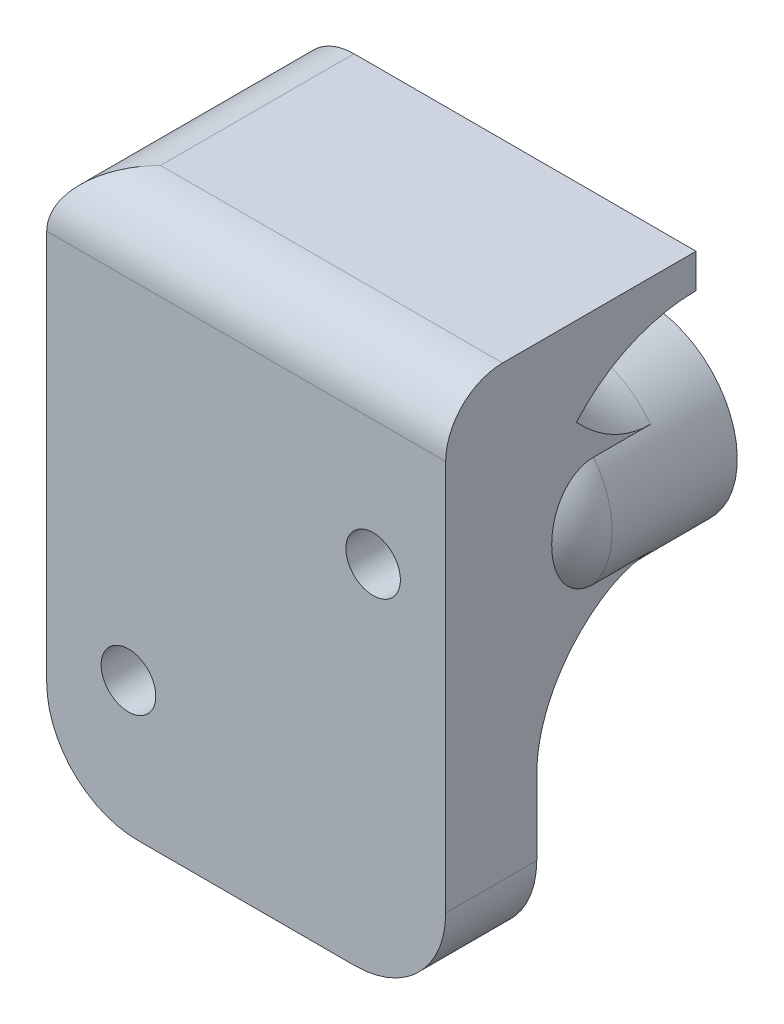
ISO-10303-21;
HEADER;
FILE_DESCRIPTION(('STEP AP214'),'2;1');
FILE_NAME('part.step','',(''),(''),'','','');
FILE_SCHEMA(('AUTOMOTIVE_DESIGN { 1 0 10303 214 1 1 1 1 }'));
ENDSEC;
DATA;
#1=APPLICATION_CONTEXT('core data for automotive mechanical design processes');
#2=APPLICATION_PROTOCOL_DEFINITION('international standard','automotive_design',2000,#1);
#3=PRODUCT_CONTEXT('',#1,'mechanical');
#4=PRODUCT('Part','Part','',(#3));
#5=PRODUCT_RELATED_PRODUCT_CATEGORY('part','',(#4));
#6=PRODUCT_DEFINITION_FORMATION('','',#4);
#7=PRODUCT_DEFINITION_CONTEXT('part definition',#1,'design');
#8=PRODUCT_DEFINITION('design','',#6,#7);
#9=PRODUCT_DEFINITION_SHAPE('','',#8);
#10=(LENGTH_UNIT() NAMED_UNIT(*) SI_UNIT(.MILLI.,.METRE.));
#11=(NAMED_UNIT(*) PLANE_ANGLE_UNIT() SI_UNIT($,.RADIAN.));
#12=(NAMED_UNIT(*) SI_UNIT($,.STERADIAN.) SOLID_ANGLE_UNIT());
#13=UNCERTAINTY_MEASURE_WITH_UNIT(LENGTH_MEASURE(1.E-05),#10,'distance_accuracy_value','');
#14=(GEOMETRIC_REPRESENTATION_CONTEXT(3) GLOBAL_UNCERTAINTY_ASSIGNED_CONTEXT((#13)) GLOBAL_UNIT_ASSIGNED_CONTEXT((#10,
#11,#12)) REPRESENTATION_CONTEXT('',''));
#15=CARTESIAN_POINT('',(0.,0.,0.));
#16=DIRECTION('',(0.,0.,1.));
#17=DIRECTION('',(1.,0.,0.));
#18=AXIS2_PLACEMENT_3D('',#15,#16,#17);
#19=CARTESIAN_POINT('',(0.,0.,0.));
#20=DIRECTION('',(0.,0.,-1.));
#21=DIRECTION('',(-1.,0.,0.));
#22=AXIS2_PLACEMENT_3D('',#19,#20,#21);
#23=PLANE('',#22);
#24=CARTESIAN_POINT('',(5.79110127419194,7.12966177068777,0.));
#25=DIRECTION('',(0.,0.,1.));
#26=DIRECTION('',(1.,0.,0.));
#27=AXIS2_PLACEMENT_3D('',#24,#25,#26);
#28=CIRCLE('',#27,1.2);
#29=CARTESIAN_POINT('',(6.99110127419194,7.12966177068777,0.));
#30=VERTEX_POINT('',#29);
#31=EDGE_CURVE('E157',#30,#30,#28,.T.);
#32=ORIENTED_EDGE('',*,*,#31,.T.);
#33=EDGE_LOOP('',(#32));
#34=FACE_BOUND('',#33,.T.);
#35=DIRECTION('',(0.,-1.,0.));
#36=VECTOR('',#35,1.);
#37=CARTESIAN_POINT('',(2.20085117670349,1.24866858143758,0.));
#38=LINE('',#37,#36);
#39=CARTESIAN_POINT('',(2.20085117670349,16.4296617706878,0.));
#40=VERTEX_POINT('',#39);
#41=CARTESIAN_POINT('',(2.20085117670349,5.24866858143758,0.));
#42=VERTEX_POINT('',#41);
#43=EDGE_CURVE('E161',#40,#42,#38,.T.);
#44=ORIENTED_EDGE('',*,*,#43,.F.);
#45=DIRECTION('',(-1.,0.,0.));
#46=VECTOR('',#45,1.);
#47=CARTESIAN_POINT('',(0.,16.4296617706878,0.));
#48=LINE('',#47,#46);
#49=CARTESIAN_POINT('',(7.55500089638622,16.4296617706878,0.));
#50=VERTEX_POINT('',#49);
#51=EDGE_CURVE('E246',#40,#50,#48,.F.);
#52=ORIENTED_EDGE('',*,*,#51,.T.);
#53=CARTESIAN_POINT('',(16.5411012741919,16.9296617706878,0.));
#54=DIRECTION('',(0.,0.,-1.));
#55=DIRECTION('',(-1.,0.,0.));
#56=AXIS2_PLACEMENT_3D('',#53,#54,#55);
#57=CIRCLE('',#56,9.);
#58=CARTESIAN_POINT('',(19.7293652888547,8.51331027061327,0.));
#59=VERTEX_POINT('',#58);
#60=EDGE_CURVE('E208',#50,#59,#57,.F.);
#61=ORIENTED_EDGE('',*,*,#60,.T.);
#62=DIRECTION('',(0.,1.,0.));
#63=VECTOR('',#62,1.);
#64=CARTESIAN_POINT('',(19.7293652888547,1.24866858143758,0.));
#65=LINE('',#64,#63);
#66=CARTESIAN_POINT('',(19.7293652888547,5.24866858143758,0.));
#67=VERTEX_POINT('',#66);
#68=EDGE_CURVE('E167',#67,#59,#65,.T.);
#69=ORIENTED_EDGE('',*,*,#68,.F.);
#70=CARTESIAN_POINT('',(15.7293652888547,5.24866858143758,0.));
#71=DIRECTION('',(0.,0.,-1.));
#72=DIRECTION('',(-1.,0.,0.));
#73=AXIS2_PLACEMENT_3D('',#70,#71,#72);
#74=CIRCLE('',#73,4.);
#75=CARTESIAN_POINT('',(15.7293652888547,1.24866858143758,0.));
#76=VERTEX_POINT('',#75);
#77=EDGE_CURVE('E185',#67,#76,#74,.T.);
#78=ORIENTED_EDGE('',*,*,#77,.T.);
#79=DIRECTION('',(1.,0.,0.));
#80=VECTOR('',#79,1.);
#81=CARTESIAN_POINT('',(2.20085117670349,1.24866858143758,0.));
#82=LINE('',#81,#80);
#83=CARTESIAN_POINT('',(6.20085117670349,1.24866858143758,0.));
#84=VERTEX_POINT('',#83);
#85=EDGE_CURVE('E174',#84,#76,#82,.T.);
#86=ORIENTED_EDGE('',*,*,#85,.F.);
#87=CARTESIAN_POINT('',(6.20085117670349,5.24866858143758,0.));
#88=DIRECTION('',(0.,0.,-1.));
#89=DIRECTION('',(-1.,0.,0.));
#90=AXIS2_PLACEMENT_3D('',#87,#88,#89);
#91=CIRCLE('',#90,4.);
#92=EDGE_CURVE('E187',#84,#42,#91,.T.);
#93=ORIENTED_EDGE('',*,*,#92,.T.);
#94=EDGE_LOOP('',(#44,#52,#61,#69,#78,#86,#93));
#95=FACE_BOUND('',#94,.T.);
#96=ADVANCED_FACE('F32',(#34,#95),#23,.T.);
#97=CARTESIAN_POINT('',(0.,0.,4.));
#98=DIRECTION('',(0.,0.,-1.));
#99=DIRECTION('',(-1.,0.,0.));
#100=AXIS2_PLACEMENT_3D('',#97,#98,#99);
#101=PLANE('',#100);
#102=DIRECTION('',(0.,1.,0.));
#103=VECTOR('',#102,1.);
#104=CARTESIAN_POINT('',(19.7293652888547,1.24866858143758,4.));
#105=LINE('',#104,#103);
#106=CARTESIAN_POINT('',(19.7293652888547,5.24866858143758,4.));
#107=VERTEX_POINT('',#106);
#108=CARTESIAN_POINT('',(19.7293652888547,22.4296617706878,4.));
#109=VERTEX_POINT('',#108);
#110=EDGE_CURVE('E170',#107,#109,#105,.T.);
#111=ORIENTED_EDGE('',*,*,#110,.T.);
#112=DIRECTION('',(-1.,0.,0.));
#113=VECTOR('',#112,1.);
#114=CARTESIAN_POINT('',(0.,22.4296617706878,4.));
#115=LINE('',#114,#113);
#116=CARTESIAN_POINT('',(2.20085117670349,22.4296617706878,4.));
#117=VERTEX_POINT('',#116);
#118=EDGE_CURVE('E41',#109,#117,#115,.T.);
#119=ORIENTED_EDGE('',*,*,#118,.T.);
#120=DIRECTION('',(0.,-1.,0.));
#121=VECTOR('',#120,1.);
#122=CARTESIAN_POINT('',(2.20085117670349,1.24866858143758,4.));
#123=LINE('',#122,#121);
#124=CARTESIAN_POINT('',(2.20085117670349,5.24866858143758,4.));
#125=VERTEX_POINT('',#124);
#126=EDGE_CURVE('E164',#117,#125,#123,.T.);
#127=ORIENTED_EDGE('',*,*,#126,.T.);
#128=CARTESIAN_POINT('',(6.20085117670349,5.24866858143758,4.));
#129=DIRECTION('',(0.,0.,-1.));
#130=DIRECTION('',(-1.,0.,0.));
#131=AXIS2_PLACEMENT_3D('',#128,#129,#130);
#132=CIRCLE('',#131,4.);
#133=CARTESIAN_POINT('',(6.20085117670349,1.24866858143758,4.));
#134=VERTEX_POINT('',#133);
#135=EDGE_CURVE('E195',#125,#134,#132,.F.);
#136=ORIENTED_EDGE('',*,*,#135,.T.);
#137=DIRECTION('',(1.,0.,0.));
#138=VECTOR('',#137,1.);
#139=CARTESIAN_POINT('',(2.20085117670349,1.24866858143758,4.));
#140=LINE('',#139,#138);
#141=CARTESIAN_POINT('',(15.7293652888547,1.24866858143758,4.));
#142=VERTEX_POINT('',#141);
#143=EDGE_CURVE('E166',#134,#142,#140,.T.);
#144=ORIENTED_EDGE('',*,*,#143,.T.);
#145=CARTESIAN_POINT('',(15.7293652888547,5.24866858143758,4.));
#146=DIRECTION('',(0.,0.,-1.));
#147=DIRECTION('',(-1.,0.,0.));
#148=AXIS2_PLACEMENT_3D('',#145,#146,#147);
#149=CIRCLE('',#148,4.);
#150=EDGE_CURVE('E193',#142,#107,#149,.F.);
#151=ORIENTED_EDGE('',*,*,#150,.T.);
#152=EDGE_LOOP('',(#111,#119,#127,#136,#144,#151));
#153=FACE_BOUND('',#152,.T.);
#154=CARTESIAN_POINT('',(5.79110127419194,7.12966177068777,4.));
#155=DIRECTION('',(0.,0.,1.));
#156=DIRECTION('',(1.,0.,0.));
#157=AXIS2_PLACEMENT_3D('',#154,#155,#156);
#158=CIRCLE('',#157,1.2);
#159=CARTESIAN_POINT('',(6.99110127419194,7.12966177068777,4.));
#160=VERTEX_POINT('',#159);
#161=EDGE_CURVE('E158',#160,#160,#158,.T.);
#162=ORIENTED_EDGE('',*,*,#161,.F.);
#163=EDGE_LOOP('',(#162));
#164=FACE_BOUND('',#163,.T.);
#165=CARTESIAN_POINT('',(16.5411012741919,16.9296617706878,4.));
#166=DIRECTION('',(0.,0.,1.));
#167=DIRECTION('',(1.,0.,0.));
#168=AXIS2_PLACEMENT_3D('',#165,#166,#167);
#169=CIRCLE('',#168,1.19774028703024);
#170=CARTESIAN_POINT('',(17.7388415612222,16.9296617706878,4.));
#171=VERTEX_POINT('',#170);
#172=EDGE_CURVE('E151',#171,#171,#169,.T.);
#173=ORIENTED_EDGE('',*,*,#172,.F.);
#174=EDGE_LOOP('',(#173));
#175=FACE_BOUND('',#174,.T.);
#176=ADVANCED_FACE('F279',(#153,#164,#175),#101,.F.);
#177=CARTESIAN_POINT('',(2.20085117670349,1.24866858143758,4.));
#178=DIRECTION('',(1.,0.,0.));
#179=DIRECTION('',(0.,0.,-1.));
#180=AXIS2_PLACEMENT_3D('',#177,#178,#179);
#181=PLANE('',#180);
#182=ORIENTED_EDGE('',*,*,#126,.F.);
#183=DIRECTION('',(0.,0.,-1.));
#184=VECTOR('',#183,1.);
#185=CARTESIAN_POINT('',(2.20085117670349,22.4296617706878,4.));
#186=LINE('',#185,#184);
#187=CARTESIAN_POINT('',(2.20085117670349,22.4296617706878,-3.39444872453601));
#188=VERTEX_POINT('',#187);
#189=EDGE_CURVE('E256',#117,#188,#186,.T.);
#190=ORIENTED_EDGE('',*,*,#189,.T.);
#191=CARTESIAN_POINT('',(2.20085117670349,16.4296617706878,-7.));
#192=DIRECTION('',(1.,0.,0.));
#193=DIRECTION('',(0.,0.,-1.));
#194=AXIS2_PLACEMENT_3D('',#191,#192,#193);
#195=CIRCLE('',#194,7.);
#196=EDGE_CURVE('E136',#188,#40,#195,.T.);
#197=ORIENTED_EDGE('',*,*,#196,.T.);
#198=ORIENTED_EDGE('',*,*,#43,.T.);
#199=DIRECTION('',(0.,0.,-1.));
#200=VECTOR('',#199,1.);
#201=CARTESIAN_POINT('',(2.20085117670349,5.24866858143758,4.));
#202=LINE('',#201,#200);
#203=EDGE_CURVE('E190',#42,#125,#202,.F.);
#204=ORIENTED_EDGE('',*,*,#203,.T.);
#205=EDGE_LOOP('',(#182,#190,#197,#198,#204));
#206=FACE_BOUND('',#205,.T.);
#207=ADVANCED_FACE('F285',(#206),#181,.F.);
#208=CARTESIAN_POINT('',(2.20085117670349,1.24866858143758,4.));
#209=DIRECTION('',(0.,1.,0.));
#210=DIRECTION('',(0.,0.,1.));
#211=AXIS2_PLACEMENT_3D('',#208,#209,#210);
#212=PLANE('',#211);
#213=ORIENTED_EDGE('',*,*,#143,.F.);
#214=DIRECTION('',(0.,0.,-1.));
#215=VECTOR('',#214,1.);
#216=CARTESIAN_POINT('',(6.20085117670349,1.24866858143758,4.));
#217=LINE('',#216,#215);
#218=EDGE_CURVE('E182',#134,#84,#217,.T.);
#219=ORIENTED_EDGE('',*,*,#218,.T.);
#220=ORIENTED_EDGE('',*,*,#85,.T.);
#221=DIRECTION('',(0.,0.,-1.));
#222=VECTOR('',#221,1.);
#223=CARTESIAN_POINT('',(15.7293652888547,1.24866858143758,4.));
#224=LINE('',#223,#222);
#225=EDGE_CURVE('E180',#76,#142,#224,.F.);
#226=ORIENTED_EDGE('',*,*,#225,.T.);
#227=EDGE_LOOP('',(#213,#219,#220,#226));
#228=FACE_BOUND('',#227,.T.);
#229=ADVANCED_FACE('F301',(#228),#212,.F.);
#230=CARTESIAN_POINT('',(19.7293652888547,1.24866858143758,4.));
#231=DIRECTION('',(-1.,0.,0.));
#232=DIRECTION('',(0.,0.,1.));
#233=AXIS2_PLACEMENT_3D('',#230,#231,#232);
#234=PLANE('',#233);
#235=DIRECTION('',(0.,0.,-1.));
#236=VECTOR('',#235,1.);
#237=CARTESIAN_POINT('',(19.7293652888547,24.9296617706878,4.));
#238=LINE('',#237,#236);
#239=CARTESIAN_POINT('',(19.7293652888547,24.9296617706878,1.5));
#240=VERTEX_POINT('',#239);
#241=CARTESIAN_POINT('',(19.7293652888547,24.9296617706878,-7.));
#242=VERTEX_POINT('',#241);
#243=EDGE_CURVE('E172',#240,#242,#238,.T.);
#244=ORIENTED_EDGE('',*,*,#243,.F.);
#245=CARTESIAN_POINT('',(19.7293652888547,22.4296617706878,1.5));
#246=DIRECTION('',(-1.,0.,0.));
#247=DIRECTION('',(0.,0.,1.));
#248=AXIS2_PLACEMENT_3D('',#245,#246,#247);
#249=CIRCLE('',#248,2.5);
#250=EDGE_CURVE('E11',#240,#109,#249,.F.);
#251=ORIENTED_EDGE('',*,*,#250,.T.);
#252=ORIENTED_EDGE('',*,*,#110,.F.);
#253=DIRECTION('',(0.,0.,-1.));
#254=VECTOR('',#253,1.);
#255=CARTESIAN_POINT('',(19.7293652888547,5.24866858143758,4.));
#256=LINE('',#255,#254);
#257=EDGE_CURVE('E197',#107,#67,#256,.T.);
#258=ORIENTED_EDGE('',*,*,#257,.T.);
#259=ORIENTED_EDGE('',*,*,#68,.T.);
#260=CARTESIAN_POINT('',(19.7293652888547,8.51331027061327,0.));
#261=CARTESIAN_POINT('',(19.7293652888547,8.70653538306606,3.4774141012101E-05));
#262=CARTESIAN_POINT('',(19.7293652888547,8.89969741678476,-0.00979195988124721));
#263=CARTESIAN_POINT('',(19.7293652888547,9.28398738332101,-0.0483805875134381));
#264=CARTESIAN_POINT('',(19.7293652888547,9.47511670430038,-0.0771285860928726));
#265=CARTESIAN_POINT('',(19.7293652888547,9.85212743336625,-0.152455526897318));
#266=CARTESIAN_POINT('',(19.7293652888547,10.0380394849147,-0.198882236521322));
#267=CARTESIAN_POINT('',(19.7293652888547,10.4048046836004,-0.308643365085156));
#268=CARTESIAN_POINT('',(19.7293652888547,10.5856574845522,-0.371978937923083));
#269=CARTESIAN_POINT('',(19.7293652888547,10.9202157564702,-0.506209951470481));
#270=CARTESIAN_POINT('',(19.7293652888547,11.0746250145604,-0.575358680792301));
#271=CARTESIAN_POINT('',(19.7293652888547,11.3776123108796,-0.725284395465473));
#272=CARTESIAN_POINT('',(19.7293652888547,11.5261910361343,-0.806060005525792));
#273=CARTESIAN_POINT('',(19.7293652888547,11.9630957144002,-1.06534819291589));
#274=CARTESIAN_POINT('',(19.7293652888547,12.2418337841929,-1.26051501792097));
#275=CARTESIAN_POINT('',(19.7293652888547,12.6508186084283,-1.59428296533686));
#276=CARTESIAN_POINT('',(19.7293652888547,12.792166319353,-1.71966665817494));
#277=CARTESIAN_POINT('',(19.7293652888547,13.0640317196447,-1.98187699967119));
#278=CARTESIAN_POINT('',(19.7293652888547,13.1945451618243,-2.11870809406444));
#279=CARTESIAN_POINT('',(19.7293652888547,13.4429438477149,-2.40306648299146));
#280=CARTESIAN_POINT('',(19.7293652888547,13.5608459213102,-2.5505790705424));
#281=CARTESIAN_POINT('',(19.7293652888547,13.7819467475739,-2.85619085906745));
#282=CARTESIAN_POINT('',(19.7293652888547,13.8851584374264,-3.01428056256346));
#283=CARTESIAN_POINT('',(19.7293652888547,14.0310179781795,-3.26740690769278));
#284=CARTESIAN_POINT('',(19.7293652888547,14.0800202018652,-3.35880674366154));
#285=CARTESIAN_POINT('',(19.7293652888547,14.1717195902881,-3.54475905299358));
#286=CARTESIAN_POINT('',(19.7293652888547,14.2144159173193,-3.63931194318242));
#287=CARTESIAN_POINT('',(19.7293652888547,14.2923354518417,-3.83094091263401));
#288=CARTESIAN_POINT('',(19.7293652888547,14.327593672673,-3.92800264080702));
#289=CARTESIAN_POINT('',(19.7293652888547,14.389806688214,-4.12471603083544));
#290=CARTESIAN_POINT('',(19.7293652888547,14.4167655995969,-4.22436638198023));
#291=CARTESIAN_POINT('',(19.7293652888547,14.4634811584599,-4.43551204081681));
#292=CARTESIAN_POINT('',(19.7293652888547,14.4822926247493,-4.54722294467497));
#293=CARTESIAN_POINT('',(19.7293652888547,14.5012837313051,-4.71608297428575));
#294=CARTESIAN_POINT('',(19.7293652888547,14.50607677003,-4.77274177914391));
#295=CARTESIAN_POINT('',(19.7293652888547,14.5124850993961,-4.88626262936694));
#296=CARTESIAN_POINT('',(19.7293652888547,14.514099032008,-4.94312475119746));
#297=CARTESIAN_POINT('',(19.7293652888547,14.5140929820158,-5.));
#298=B_SPLINE_CURVE_WITH_KNOTS('',3,(#260,#261,#262,#263,#264,#265,#266,#267,#268,#269,#270,
#271,#272,#273,#274,#275,#276,#277,#278,#279,#280,#281,#282,#283,#284,#285,#286,#287,#288,#289,
#290,#291,#292,#293,#294,#295,#296,#297),.UNSPECIFIED.,.F.,.F.,(4,2,2,2,2,2,2,2,2,2,2,2,2,2,2,2,
2,2,4),(0.,0.579333604188391,1.15824224259981,1.73227463934319,2.30634621934031,
2.81337446344094,3.32034278267794,4.33670454930488,4.90303877167546,5.46959396688484,
6.03538340442442,6.60067145124535,6.91159758324274,7.22256498309503,7.53203418757615,
7.84134963903098,8.18049195153868,8.35099695333732,8.52157477454315),.UNSPECIFIED.);
#299=CARTESIAN_POINT('',(19.7293652888547,14.5140929820158,-5.));
#300=VERTEX_POINT('',#299);
#301=EDGE_CURVE('E217',#59,#300,#298,.T.);
#302=ORIENTED_EDGE('',*,*,#301,.T.);
#303=DIRECTION('',(0.,0.,1.));
#304=VECTOR('',#303,1.);
#305=CARTESIAN_POINT('',(19.7293652888547,14.5140929820158,0.));
#306=LINE('',#305,#304);
#307=CARTESIAN_POINT('',(19.7293652888547,14.5140929820158,-2.5));
#308=VERTEX_POINT('',#307);
#309=EDGE_CURVE('E200',#308,#300,#306,.F.);
#310=ORIENTED_EDGE('',*,*,#309,.F.);
#311=CARTESIAN_POINT('',(19.7293652888547,14.5140929820158,-2.5));
#312=CARTESIAN_POINT('',(19.7293652888547,14.5140894337805,-2.45347711818692));
#313=CARTESIAN_POINT('',(19.7293652888547,14.5162452140121,-2.40698093774308));
#314=CARTESIAN_POINT('',(19.7293652888547,14.5248162895305,-2.31440079045376));
#315=CARTESIAN_POINT('',(19.7293652888547,14.5312299189341,-2.2683166695338));
#316=CARTESIAN_POINT('',(19.7293652888547,14.5566668303771,-2.1317275092124));
#317=CARTESIAN_POINT('',(19.7293652888547,14.5818878415186,-2.04230563883819));
#318=CARTESIAN_POINT('',(19.7293652888547,14.64749720379,-1.86942210762563));
#319=CARTESIAN_POINT('',(19.7293652888547,14.6878706018194,-1.78595466699716));
#320=CARTESIAN_POINT('',(19.7293652888547,14.7818379711103,-1.62678404409055));
#321=CARTESIAN_POINT('',(19.7293652888547,14.8354432959053,-1.55108760904545));
#322=CARTESIAN_POINT('',(19.7293652888547,14.9544989899357,-1.40774618488951));
#323=CARTESIAN_POINT('',(19.7293652888547,15.020119750595,-1.34024384438985));
#324=CARTESIAN_POINT('',(19.7293652888547,15.1602488434442,-1.21528091909444));
#325=CARTESIAN_POINT('',(19.7293652888547,15.2347601242837,-1.15782368154266));
#326=CARTESIAN_POINT('',(19.7293652888547,15.4274567439655,-1.02815510536161));
#327=CARTESIAN_POINT('',(19.7293652888547,15.5496193191199,-0.961835070500561));
#328=CARTESIAN_POINT('',(19.7293652888547,15.8030858061487,-0.849773590794555));
#329=CARTESIAN_POINT('',(19.7293652888547,15.9344105482196,-0.804080927237992));
#330=CARTESIAN_POINT('',(19.7293652888547,16.2343692742419,-0.722654903894093));
#331=CARTESIAN_POINT('',(19.7293652888547,16.4043634375779,-0.691980378715369));
#332=CARTESIAN_POINT('',(19.7293652888547,16.7469849771354,-0.656592054654963));
#333=CARTESIAN_POINT('',(19.7293652888547,16.919613900913,-0.651894152013298));
#334=CARTESIAN_POINT('',(19.7293652888547,17.2469377100412,-0.667181338895522));
#335=CARTESIAN_POINT('',(19.7293652888547,17.4017436253629,-0.684809820728294));
#336=CARTESIAN_POINT('',(19.7293652888547,17.7071437462165,-0.742329485160848));
#337=CARTESIAN_POINT('',(19.7293652888547,17.8577434232454,-0.782190181836723));
#338=CARTESIAN_POINT('',(19.7293652888547,18.1221279043084,-0.876695799985978));
#339=CARTESIAN_POINT('',(19.7293652888547,18.2374363680366,-0.927042639520271));
#340=CARTESIAN_POINT('',(19.7293652888547,18.4587307249076,-1.04528674372295));
#341=CARTESIAN_POINT('',(19.7293652888547,18.5647278177436,-1.11316252627177));
#342=CARTESIAN_POINT('',(19.7293652888547,18.7449405695409,-1.25312407398523));
#343=CARTESIAN_POINT('',(19.7293652888547,18.8214427333635,-1.32225355244979));
#344=CARTESIAN_POINT('',(19.7293652888547,18.9620794314948,-1.47223774737458));
#345=CARTESIAN_POINT('',(19.7293652888547,19.0262159163156,-1.5530906111046));
#346=CARTESIAN_POINT('',(19.7293652888547,19.1393792537446,-1.72573825215388));
#347=CARTESIAN_POINT('',(19.7293652888547,19.1882851679789,-1.81761296497215));
#348=CARTESIAN_POINT('',(19.7293652888547,19.2672938413723,-2.00908212938374));
#349=CARTESIAN_POINT('',(19.7293652888547,19.2974312765286,-2.10866196011445));
#350=CARTESIAN_POINT('',(19.7293652888547,19.3265105498058,-2.25788115753449));
#351=CARTESIAN_POINT('',(19.7293652888547,19.3335209745311,-2.30605708626224));
#352=CARTESIAN_POINT('',(19.7293652888547,19.3428799753125,-2.40281110669486));
#353=CARTESIAN_POINT('',(19.7293652888547,19.3452331566073,-2.45138875337517));
#354=CARTESIAN_POINT('',(19.7293652888547,19.3452305593598,-2.5));
#355=B_SPLINE_CURVE_WITH_KNOTS('',3,(#311,#312,#313,#314,#315,#316,#317,#318,#319,#320,#321,
#322,#323,#324,#325,#326,#327,#328,#329,#330,#331,#332,#333,#334,#335,#336,#337,#338,#339,#340,
#341,#342,#343,#344,#345,#346,#347,#348,#349,#350,#351,#352,#353,#354),.UNSPECIFIED.,.F.,.F.,(4,
2,2,2,2,2,2,2,2,2,2,2,2,2,2,2,2,2,2,2,2,4),(0.,0.139466889013885,0.278879243749997,
0.55599003841672,0.832828082896295,1.10990449649993,1.39126666915975,1.6727224197741,
2.08741430993559,2.50308182476833,3.01898714905618,3.5352081436356,4.00121323748316,
4.46658088734936,4.84275133933401,5.21846295564366,5.52655547288592,5.83459935303197,
6.14503031552213,6.4548860215234,6.60074185792532,6.7464533949721),.UNSPECIFIED.);
#356=CARTESIAN_POINT('',(19.7293652888547,19.3452305593598,-2.5));
#357=VERTEX_POINT('',#356);
#358=EDGE_CURVE('E250',#308,#357,#355,.T.);
#359=ORIENTED_EDGE('',*,*,#358,.T.);
#360=DIRECTION('',(0.,0.,1.));
#361=VECTOR('',#360,1.);
#362=CARTESIAN_POINT('',(19.7293652888547,19.3452305593598,-5.));
#363=LINE('',#362,#361);
#364=CARTESIAN_POINT('',(19.7293652888547,19.3452305593598,-5.));
#365=VERTEX_POINT('',#364);
#366=EDGE_CURVE('E205',#365,#357,#363,.T.);
#367=ORIENTED_EDGE('',*,*,#366,.F.);
#368=CARTESIAN_POINT('',(19.7293652888547,19.3452305593598,-5.));
#369=CARTESIAN_POINT('',(19.7293652888547,19.3452257538764,-4.94641155230876));
#370=CARTESIAN_POINT('',(19.7293652888547,19.3466578876404,-4.89283366196071));
#371=CARTESIAN_POINT('',(19.7293652888547,19.3523494541674,-4.78583902131151));
#372=CARTESIAN_POINT('',(19.7293652888547,19.3566083027105,-4.73242224000383));
#373=CARTESIAN_POINT('',(19.7293652888547,19.3735245956512,-4.57288626787006));
#374=CARTESIAN_POINT('',(19.7293652888547,19.3903223176076,-4.46718235408305));
#375=CARTESIAN_POINT('',(19.7293652888547,19.433768494182,-4.25948617948964));
#376=CARTESIAN_POINT('',(19.7293652888547,19.4602690726419,-4.15746223191707));
#377=CARTESIAN_POINT('',(19.7293652888547,19.522040218058,-3.95605234976059));
#378=CARTESIAN_POINT('',(19.7293652888547,19.5573171847573,-3.85666839905297));
#379=CARTESIAN_POINT('',(19.7293652888547,19.6477885595841,-3.63015103752753));
#380=CARTESIAN_POINT('',(19.7293652888547,19.7057572652161,-3.50412790279998));
#381=CARTESIAN_POINT('',(19.7293652888547,19.8325626959362,-3.25770909290328));
#382=CARTESIAN_POINT('',(19.7293652888547,19.9014023334134,-3.13731493700663));
#383=CARTESIAN_POINT('',(19.7293652888547,20.0487633353711,-2.90133734643436));
#384=CARTESIAN_POINT('',(19.7293652888547,20.1273554790011,-2.78579833339527));
#385=CARTESIAN_POINT('',(19.7293652888547,20.2925067117484,-2.56054863602586));
#386=CARTESIAN_POINT('',(19.7293652888547,20.3790682088501,-2.45083972919184));
#387=CARTESIAN_POINT('',(19.7293652888547,20.591693985257,-2.19884818937764));
#388=CARTESIAN_POINT('',(19.7293652888547,20.7207515599977,-2.05907626702185));
#389=CARTESIAN_POINT('',(19.7293652888547,20.9901647612702,-1.79093148079402));
#390=CARTESIAN_POINT('',(19.7293652888547,21.1305244591569,-1.66256276002696));
#391=CARTESIAN_POINT('',(19.7293652888547,21.5657863382666,-1.29641792816295));
#392=CARTESIAN_POINT('',(19.7293652888547,21.8760091598187,-1.07627158684845));
#393=CARTESIAN_POINT('',(19.7293652888547,22.3964490745346,-0.769163554134403));
#394=CARTESIAN_POINT('',(19.7293652888547,22.5963987248889,-0.664337484051885));
#395=CARTESIAN_POINT('',(19.7293652888547,23.0060847604094,-0.475893581300193));
#396=CARTESIAN_POINT('',(19.7293652888547,23.2158229649726,-0.392279710076029));
#397=CARTESIAN_POINT('',(19.7293652888547,23.4296617706878,-0.320066818431413));
#398=B_SPLINE_CURVE_WITH_KNOTS('',3,(#368,#369,#370,#371,#372,#373,#374,#375,#376,#377,#378,
#379,#380,#381,#382,#383,#384,#385,#386,#387,#388,#389,#390,#391,#392,#393,#394,#395,#396,#397),
.UNSPECIFIED.,.F.,.F.,(4,2,2,2,2,2,2,2,2,2,2,2,2,2,4),(0.,0.160726006571149,0.321418804947108,
0.641911619544182,0.957710523432183,1.27374038635549,1.68922878162049,2.1048286782003,
2.52364370696536,2.94258570095701,3.51251793426187,4.08265640025004,5.21773922342928,
5.89397425334071,6.57033547946331),.UNSPECIFIED.);
#399=CARTESIAN_POINT('',(19.7293652888547,21.04860921514,-1.74021630621675));
#400=VERTEX_POINT('',#399);
#401=EDGE_CURVE('E131',#365,#400,#398,.T.);
#402=ORIENTED_EDGE('',*,*,#401,.T.);
#403=CARTESIAN_POINT('',(19.7293652888547,16.4296617706878,-7.));
#404=DIRECTION('',(-1.,0.,0.));
#405=DIRECTION('',(0.,0.,1.));
#406=AXIS2_PLACEMENT_3D('',#403,#404,#405);
#407=CIRCLE('',#406,7.);
#408=CARTESIAN_POINT('',(19.7293652888547,23.4296617706878,-7.));
#409=VERTEX_POINT('',#408);
#410=EDGE_CURVE('E126',#400,#409,#407,.T.);
#411=ORIENTED_EDGE('',*,*,#410,.T.);
#412=DIRECTION('',(0.,-1.,0.));
#413=VECTOR('',#412,1.);
#414=CARTESIAN_POINT('',(19.7293652888547,24.9296617706878,-7.));
#415=LINE('',#414,#413);
#416=EDGE_CURVE('E129',#242,#409,#415,.T.);
#417=ORIENTED_EDGE('',*,*,#416,.F.);
#418=EDGE_LOOP('',(#244,#251,#252,#258,#259,#302,#310,#359,#367,#402,#411,#417));
#419=FACE_BOUND('',#418,.T.);
#420=ADVANCED_FACE('F128',(#419),#234,.F.);
#421=CARTESIAN_POINT('',(2.20085117670349,24.9296617706878,4.));
#422=DIRECTION('',(0.,-1.,0.));
#423=DIRECTION('',(0.,0.,-1.));
#424=AXIS2_PLACEMENT_3D('',#421,#422,#423);
#425=PLANE('',#424);
#426=DIRECTION('',(1.,0.,0.));
#427=VECTOR('',#426,1.);
#428=CARTESIAN_POINT('',(19.7293652888547,24.9296617706878,-7.));
#429=LINE('',#428,#427);
#430=CARTESIAN_POINT('',(4.7008511767035,24.9296617706878,-7.));
#431=VERTEX_POINT('',#430);
#432=EDGE_CURVE('E144',#431,#242,#429,.T.);
#433=ORIENTED_EDGE('',*,*,#432,.F.);
#434=DIRECTION('',(0.,0.,-1.));
#435=VECTOR('',#434,1.);
#436=CARTESIAN_POINT('',(4.70085117670349,24.9296617706878,4.));
#437=LINE('',#436,#435);
#438=CARTESIAN_POINT('',(4.70085117670349,24.9296617706878,1.5));
#439=VERTEX_POINT('',#438);
#440=EDGE_CURVE('E54',#431,#439,#437,.F.);
#441=ORIENTED_EDGE('',*,*,#440,.T.);
#442=DIRECTION('',(-1.,0.,0.));
#443=VECTOR('',#442,1.);
#444=CARTESIAN_POINT('',(2.20085117670349,24.9296617706878,1.5));
#445=LINE('',#444,#443);
#446=EDGE_CURVE('E273',#439,#240,#445,.F.);
#447=ORIENTED_EDGE('',*,*,#446,.T.);
#448=ORIENTED_EDGE('',*,*,#243,.T.);
#449=EDGE_LOOP('',(#433,#441,#447,#448));
#450=FACE_BOUND('',#449,.T.);
#451=ADVANCED_FACE('F291',(#450),#425,.F.);
#452=CARTESIAN_POINT('',(5.79110127419194,7.12966177068777,4.));
#453=DIRECTION('',(0.,0.,-1.));
#454=DIRECTION('',(-1.,0.,0.));
#455=AXIS2_PLACEMENT_3D('',#452,#453,#454);
#456=CYLINDRICAL_SURFACE('',#455,1.2);
#457=ORIENTED_EDGE('',*,*,#161,.T.);
#458=EDGE_LOOP('',(#457));
#459=FACE_BOUND('',#458,.T.);
#460=ORIENTED_EDGE('',*,*,#31,.F.);
#461=EDGE_LOOP('',(#460));
#462=FACE_BOUND('',#461,.T.);
#463=ADVANCED_FACE('F293',(#459,#462),#456,.F.);
#464=CARTESIAN_POINT('',(16.5411012741919,16.9296617706878,4.));
#465=DIRECTION('',(0.,0.,-1.));
#466=DIRECTION('',(-1.,0.,0.));
#467=AXIS2_PLACEMENT_3D('',#464,#465,#466);
#468=CYLINDRICAL_SURFACE('',#467,1.19774028703024);
#469=ORIENTED_EDGE('',*,*,#172,.T.);
#470=EDGE_LOOP('',(#469));
#471=FACE_BOUND('',#470,.T.);
#472=CARTESIAN_POINT('',(16.5411012741919,16.9296617706878,-8.));
#473=DIRECTION('',(0.,0.,-1.));
#474=DIRECTION('',(-1.,0.,0.));
#475=AXIS2_PLACEMENT_3D('',#472,#473,#474);
#476=CIRCLE('',#475,1.19774028703024);
#477=CARTESIAN_POINT('',(15.3433609871617,16.9296617706878,-8.));
#478=VERTEX_POINT('',#477);
#479=EDGE_CURVE('E290',#478,#478,#476,.T.);
#480=ORIENTED_EDGE('',*,*,#479,.T.);
#481=EDGE_LOOP('',(#480));
#482=FACE_BOUND('',#481,.T.);
#483=ADVANCED_FACE('F298',(#471,#482),#468,.F.);
#484=CARTESIAN_POINT('',(0.,0.,-7.));
#485=DIRECTION('',(0.,0.,-1.));
#486=DIRECTION('',(-1.,0.,0.));
#487=AXIS2_PLACEMENT_3D('',#484,#485,#486);
#488=PLANE('',#487);
#489=DIRECTION('',(-1.,0.,0.));
#490=VECTOR('',#489,1.);
#491=CARTESIAN_POINT('',(19.7293652888547,23.4296617706878,-7.));
#492=LINE('',#491,#490);
#493=CARTESIAN_POINT('',(2.40956332922557,23.4296617706878,-7.));
#494=VERTEX_POINT('',#493);
#495=EDGE_CURVE('E142',#409,#494,#492,.T.);
#496=ORIENTED_EDGE('',*,*,#495,.T.);
#497=CARTESIAN_POINT('',(4.70085117670349,22.4296617706878,-7.));
#498=DIRECTION('',(0.,0.,-1.));
#499=DIRECTION('',(-1.,0.,0.));
#500=AXIS2_PLACEMENT_3D('',#497,#498,#499);
#501=CIRCLE('',#500,2.5);
#502=EDGE_CURVE('E271',#494,#431,#501,.T.);
#503=ORIENTED_EDGE('',*,*,#502,.T.);
#504=ORIENTED_EDGE('',*,*,#432,.T.);
#505=ORIENTED_EDGE('',*,*,#416,.T.);
#506=EDGE_LOOP('',(#496,#503,#504,#505));
#507=FACE_BOUND('',#506,.T.);
#508=ADVANCED_FACE('F141',(#507),#488,.T.);
#509=CARTESIAN_POINT('',(6.20085117670349,5.24866858143758,4.));
#510=DIRECTION('',(0.,0.,-1.));
#511=DIRECTION('',(-1.,0.,0.));
#512=AXIS2_PLACEMENT_3D('',#509,#510,#511);
#513=CYLINDRICAL_SURFACE('',#512,4.);
#514=ORIENTED_EDGE('',*,*,#135,.F.);
#515=ORIENTED_EDGE('',*,*,#203,.F.);
#516=ORIENTED_EDGE('',*,*,#92,.F.);
#517=ORIENTED_EDGE('',*,*,#218,.F.);
#518=EDGE_LOOP('',(#514,#515,#516,#517));
#519=FACE_BOUND('',#518,.T.);
#520=ADVANCED_FACE('F316',(#519),#513,.T.);
#521=CARTESIAN_POINT('',(15.7293652888547,5.24866858143758,4.));
#522=DIRECTION('',(0.,0.,-1.));
#523=DIRECTION('',(-1.,0.,0.));
#524=AXIS2_PLACEMENT_3D('',#521,#522,#523);
#525=CYLINDRICAL_SURFACE('',#524,4.);
#526=ORIENTED_EDGE('',*,*,#150,.F.);
#527=ORIENTED_EDGE('',*,*,#225,.F.);
#528=ORIENTED_EDGE('',*,*,#77,.F.);
#529=ORIENTED_EDGE('',*,*,#257,.F.);
#530=EDGE_LOOP('',(#526,#527,#528,#529));
#531=FACE_BOUND('',#530,.T.);
#532=ADVANCED_FACE('F233',(#531),#525,.T.);
#533=CARTESIAN_POINT('',(16.5411012741919,16.9296617706878,-8.));
#534=DIRECTION('',(0.,0.,-1.));
#535=DIRECTION('',(-1.,0.,0.));
#536=AXIS2_PLACEMENT_3D('',#533,#534,#535);
#537=PLANE('',#536);
#538=CARTESIAN_POINT('',(16.5411012741919,16.9296617706878,-8.));
#539=DIRECTION('',(0.,0.,-1.));
#540=DIRECTION('',(-1.,0.,0.));
#541=AXIS2_PLACEMENT_3D('',#538,#539,#540);
#542=CIRCLE('',#541,4.);
#543=CARTESIAN_POINT('',(12.5411012741919,16.9296617706878,-8.));
#544=VERTEX_POINT('',#543);
#545=EDGE_CURVE('E145',#544,#544,#542,.T.);
#546=ORIENTED_EDGE('',*,*,#545,.T.);
#547=EDGE_LOOP('',(#546));
#548=FACE_BOUND('',#547,.T.);
#549=ORIENTED_EDGE('',*,*,#479,.F.);
#550=EDGE_LOOP('',(#549));
#551=FACE_BOUND('',#550,.T.);
#552=ADVANCED_FACE('F319',(#548,#551),#537,.T.);
#553=CARTESIAN_POINT('',(16.5411012741919,16.9296617706878,-8.));
#554=DIRECTION('',(0.,0.,1.));
#555=DIRECTION('',(1.,0.,0.));
#556=AXIS2_PLACEMENT_3D('',#553,#554,#555);
#557=CYLINDRICAL_SURFACE('',#556,4.);
#558=ORIENTED_EDGE('',*,*,#545,.F.);
#559=EDGE_LOOP('',(#558));
#560=FACE_BOUND('',#559,.T.);
#561=ORIENTED_EDGE('',*,*,#366,.T.);
#562=CARTESIAN_POINT('',(16.5411012741919,16.9296617706878,-2.5));
#563=DIRECTION('',(0.,0.,-1.));
#564=DIRECTION('',(-1.,0.,0.));
#565=AXIS2_PLACEMENT_3D('',#562,#563,#564);
#566=CIRCLE('',#565,4.);
#567=EDGE_CURVE('E135',#357,#308,#566,.T.);
#568=ORIENTED_EDGE('',*,*,#567,.T.);
#569=ORIENTED_EDGE('',*,*,#309,.T.);
#570=CARTESIAN_POINT('',(16.5411012741919,16.9296617706878,-5.));
#571=DIRECTION('',(0.,0.,-1.));
#572=DIRECTION('',(-1.,0.,0.));
#573=AXIS2_PLACEMENT_3D('',#570,#571,#572);
#574=CIRCLE('',#573,4.);
#575=EDGE_CURVE('E202',#300,#365,#574,.T.);
#576=ORIENTED_EDGE('',*,*,#575,.T.);
#577=EDGE_LOOP('',(#561,#568,#569,#576));
#578=FACE_BOUND('',#577,.T.);
#579=ADVANCED_FACE('F231',(#560,#578),#557,.T.);
#580=CARTESIAN_POINT('',(16.5411012741919,16.9296617706878,-5.));
#581=DIRECTION('',(0.,0.,-1.));
#582=DIRECTION('',(-1.,0.,0.));
#583=AXIS2_PLACEMENT_3D('',#580,#581,#582);
#584=TOROIDAL_SURFACE('',#583,9.,5.);
#585=ORIENTED_EDGE('',*,*,#60,.F.);
#586=CARTESIAN_POINT('',(19.7293652888547,21.04860921514,-1.74021630621676));
#587=CARTESIAN_POINT('',(19.6238492358102,21.0903872800162,-1.77690038690114));
#588=CARTESIAN_POINT('',(19.5174251236056,21.130425891728,-1.81294705048153));
#589=CARTESIAN_POINT('',(19.30263795096,21.2068584129527,-1.88325463203436));
#590=CARTESIAN_POINT('',(19.1942740318656,21.2432506589057,-1.91751473154602));
#591=CARTESIAN_POINT('',(18.8651179109005,21.3470057737947,-2.01713616696608));
#592=CARTESIAN_POINT('',(18.6413363976148,21.4085167629655,-2.07895342961292));
#593=CARTESIAN_POINT('',(18.1875147432674,21.5136928894129,-2.18768525191358));
#594=CARTESIAN_POINT('',(17.957525043168,21.5574719926734,-2.2346945361394));
#595=CARTESIAN_POINT('',(17.6083688337469,21.6086147710913,-2.29053398642686));
#596=CARTESIAN_POINT('',(17.4913994993514,21.623234478387,-2.30669311382699));
#597=CARTESIAN_POINT('',(17.2563378499486,21.647459044938,-2.33363941863759));
#598=CARTESIAN_POINT('',(17.1382457223809,21.6570647267729,-2.34442747718919));
#599=CARTESIAN_POINT('',(16.8556549475001,21.6738033613278,-2.36327557477458));
#600=CARTESIAN_POINT('',(16.690822270979,21.6785542504223,-2.36867926606427));
#601=CARTESIAN_POINT('',(16.3611759373588,21.6779400886042,-2.36798411717505));
#602=CARTESIAN_POINT('',(16.1963622927264,21.6725727784757,-2.36188270810954));
#603=CARTESIAN_POINT('',(15.8687760491814,21.6519432850381,-2.33866862426923));
#604=CARTESIAN_POINT('',(15.7059981181165,21.6367182327073,-2.32159727159101));
#605=CARTESIAN_POINT('',(15.3829642125071,21.5968799215467,-2.27763540449924));
#606=CARTESIAN_POINT('',(15.2227084960202,21.572265708494,-2.25074389207217));
#607=CARTESIAN_POINT('',(14.8409021796039,21.502473997253,-2.17608702635832));
#608=CARTESIAN_POINT('',(14.6209272723467,21.4530047438888,-2.12428022977028));
#609=CARTESIAN_POINT('',(14.1881862460581,21.3385399350285,-2.00905958316911));
#610=CARTESIAN_POINT('',(13.9754245786956,21.2735349838769,-1.94563871466192));
#611=CARTESIAN_POINT('',(13.5556217372507,21.129095535924,-1.81105652599566));
#612=CARTESIAN_POINT('',(13.348631316667,21.0495627754758,-1.73984390626006));
#613=CARTESIAN_POINT('',(12.9414788471955,20.8776549059746,-1.59369951811892));
#614=CARTESIAN_POINT('',(12.7413162021618,20.7852809217056,-1.51876807582039));
#615=CARTESIAN_POINT('',(12.3882397587967,20.6091169561628,-1.38379244092491));
#616=CARTESIAN_POINT('',(12.2341587000834,20.5275385196764,-1.32389383407497));
#617=CARTESIAN_POINT('',(11.929660817474,20.3573197620797,-1.20480318259745));
#618=CARTESIAN_POINT('',(11.7792443585935,20.2686787412196,-1.14561120865168));
#619=CARTESIAN_POINT('',(11.3330396167832,19.9925884440055,-0.970660310154153));
#620=CARTESIAN_POINT('',(11.0423882958012,19.7950185424589,-0.857563121350649));
#621=CARTESIAN_POINT('',(10.4749993289649,19.3761756724851,-0.646025847674));
#622=CARTESIAN_POINT('',(10.1982127101417,19.1549962708789,-0.547531347486806));
#623=CARTESIAN_POINT('',(9.6572000997805,18.6906668239202,-0.370556791915068));
#624=CARTESIAN_POINT('',(9.39296455892242,18.4475339038632,-0.292061315470526));
#625=CARTESIAN_POINT('',(8.93300989849246,17.9963943728378,-0.174506851923102));
#626=CARTESIAN_POINT('',(8.73482566978988,17.7921536823223,-0.130591111488884));
#627=CARTESIAN_POINT('',(8.3468132426515,17.3731503686428,-0.0606271189469784));
#628=CARTESIAN_POINT('',(8.15697922878332,17.1583952956526,-0.0345662415249991));
#629=CARTESIAN_POINT('',(7.83366529929595,16.7760407862381,-0.00666236713149626));
#630=CARTESIAN_POINT('',(7.69820203175997,16.6104472859374,-0.000326896856824369));
#631=CARTESIAN_POINT('',(7.56192859342082,16.4384182274071,-4.10771447700883E-06));
#632=CARTESIAN_POINT('',(7.55846383819999,16.4340406968292,1.27816212527907E-09));
#633=CARTESIAN_POINT('',(7.55500089638622,16.4296617706878,0.));
#634=B_SPLINE_CURVE_WITH_KNOTS('',3,(#586,#587,#588,#589,#590,#591,#592,#593,#594,#595,#596,
#597,#598,#599,#600,#601,#602,#603,#604,#605,#606,#607,#608,#609,#610,#611,#612,#613,#614,#615,
#616,#617,#618,#619,#620,#621,#622,#623,#624,#625,#626,#627,#628,#629,#630,#631,#632,#633),
.UNSPECIFIED.,.F.,.F.,(4,2,2,2,2,2,2,2,2,2,2,2,2,2,2,2,2,2,2,2,2,2,2,4),(0.,0.357773179227664,
0.715708846991689,1.43523086628782,2.15005206549924,2.50679595966799,2.86348130955259,
3.35771665235467,3.8520623622856,4.34455677730578,4.8371012580024,5.52994391031311,
6.22320664403098,6.92134488927229,7.61942202192082,8.17228626163968,8.72520534655563,
9.83137170219213,10.9333064442492,12.0343889054473,12.8974865201018,13.7599731999935,
14.4016139855554,14.4183622870649),.UNSPECIFIED.);
#635=EDGE_CURVE('E240',#50,#400,#634,.F.);
#636=ORIENTED_EDGE('',*,*,#635,.T.);
#637=ORIENTED_EDGE('',*,*,#401,.F.);
#638=ORIENTED_EDGE('',*,*,#575,.F.);
#639=ORIENTED_EDGE('',*,*,#301,.F.);
#640=EDGE_LOOP('',(#585,#636,#637,#638,#639));
#641=FACE_BOUND('',#640,.T.);
#642=ADVANCED_FACE('F226',(#641),#584,.F.);
#643=CARTESIAN_POINT('',(19.7293652888547,16.4296617706878,-7.));
#644=DIRECTION('',(-1.,0.,0.));
#645=DIRECTION('',(0.,0.,1.));
#646=AXIS2_PLACEMENT_3D('',#643,#644,#645);
#647=CYLINDRICAL_SURFACE('',#646,7.);
#648=ORIENTED_EDGE('',*,*,#196,.F.);
#649=CARTESIAN_POINT('',(2.20085117670349,22.4296617706878,-3.39444872453601));
#650=CARTESIAN_POINT('',(2.2008559928751,22.4764588434271,-3.47232221099782));
#651=CARTESIAN_POINT('',(2.2021644931597,22.5217266850949,-3.55108829129461));
#652=CARTESIAN_POINT('',(2.20691626388193,22.6091287945536,-3.7102542838733));
#653=CARTESIAN_POINT('',(2.21035901312463,22.6512638245812,-3.79065379262822));
#654=CARTESIAN_POINT('',(2.22317401753228,22.7728219890931,-4.03399660433839));
#655=CARTESIAN_POINT('',(2.23503462925031,22.8474771834925,-4.1992157254921));
#656=CARTESIAN_POINT('',(2.26173916493118,22.9822473090817,-4.53118159186991));
#657=CARTESIAN_POINT('',(2.27651606153357,23.0426318626304,-4.69782546097244));
#658=CARTESIAN_POINT('',(2.30639943851231,23.1505931999322,-5.03520017494239));
#659=CARTESIAN_POINT('',(2.32150591954061,23.1981699583479,-5.20593102789428));
#660=CARTESIAN_POINT('',(2.34626805351532,23.2705110342463,-5.50968776756169));
#661=CARTESIAN_POINT('',(2.35636595845881,23.298009706317,-5.6420327719683));
#662=CARTESIAN_POINT('',(2.3744326737432,23.3453145166251,-5.90820699222599));
#663=CARTESIAN_POINT('',(2.38240202092676,23.3651225950767,-6.04203582495611));
#664=CARTESIAN_POINT('',(2.39560653205935,23.397213244145,-6.31289472703493));
#665=CARTESIAN_POINT('',(2.40079641763542,23.4093717244108,-6.44994193620898));
#666=CARTESIAN_POINT('',(2.40603242196946,23.4215406122413,-6.65595216732497));
#667=CARTESIAN_POINT('',(2.40735296666252,23.424585438156,-6.72471704187558));
#668=CARTESIAN_POINT('',(2.40911974571846,23.4286461100202,-6.86231964596245));
#669=CARTESIAN_POINT('',(2.40956595715807,23.4296619027724,-6.93115737736153));
#670=CARTESIAN_POINT('',(2.40956332922544,23.4296617706878,-7.00000000000001));
#671=B_SPLINE_CURVE_WITH_KNOTS('',3,(#649,#650,#651,#652,#653,#654,#655,#656,#657,#658,#659,
#660,#661,#662,#663,#664,#665,#666,#667,#668,#669,#670),.UNSPECIFIED.,.F.,.F.,(4,2,2,2,2,2,2,2,
2,2,4),(0.,0.272494308725413,0.544922099091551,1.08931898493075,1.62241698877313,
2.15551604722492,2.5619362400444,2.96825383279801,3.3810033272539,3.58750720087338,
3.79401648854091),.UNSPECIFIED.);
#672=EDGE_CURVE('E149',#188,#494,#671,.T.);
#673=ORIENTED_EDGE('',*,*,#672,.T.);
#674=ORIENTED_EDGE('',*,*,#495,.F.);
#675=ORIENTED_EDGE('',*,*,#410,.F.);
#676=ORIENTED_EDGE('',*,*,#635,.F.);
#677=ORIENTED_EDGE('',*,*,#51,.F.);
#678=EDGE_LOOP('',(#648,#673,#674,#675,#676,#677));
#679=FACE_BOUND('',#678,.T.);
#680=ADVANCED_FACE('F148',(#679),#647,.F.);
#681=CARTESIAN_POINT('',(16.5411012741919,16.9296617706878,-2.5));
#682=DIRECTION('',(0.,0.,-1.));
#683=DIRECTION('',(-1.,0.,0.));
#684=AXIS2_PLACEMENT_3D('',#681,#682,#683);
#685=DEGENERATE_TOROIDAL_SURFACE('',#684,1.5,2.5,.T.);
#686=ORIENTED_EDGE('',*,*,#567,.F.);
#687=ORIENTED_EDGE('',*,*,#358,.F.);
#688=EDGE_LOOP('',(#686,#687));
#689=FACE_BOUND('',#688,.T.);
#690=ADVANCED_FACE('F258',(#689),#685,.T.);
#691=CARTESIAN_POINT('',(0.,22.4296617706878,1.5));
#692=DIRECTION('',(-1.,0.,0.));
#693=DIRECTION('',(0.,0.,1.));
#694=AXIS2_PLACEMENT_3D('',#691,#692,#693);
#695=CYLINDRICAL_SURFACE('',#694,2.5);
#696=ORIENTED_EDGE('',*,*,#250,.F.);
#697=ORIENTED_EDGE('',*,*,#446,.F.);
#698=CARTESIAN_POINT('',(4.70085117670349,22.4296617706878,1.5));
#699=DIRECTION('',(-0.707106781186547,0.,-0.707106781186547));
#700=DIRECTION('',(-0.707106781186547,0.,0.707106781186547));
#701=AXIS2_PLACEMENT_3D('',#698,#699,#700);
#702=ELLIPSE('',#701,3.53553390593274,2.5);
#703=EDGE_CURVE('E36',#117,#439,#702,.T.);
#704=ORIENTED_EDGE('',*,*,#703,.F.);
#705=ORIENTED_EDGE('',*,*,#118,.F.);
#706=EDGE_LOOP('',(#696,#697,#704,#705));
#707=FACE_BOUND('',#706,.T.);
#708=ADVANCED_FACE('F34',(#707),#695,.T.);
#709=CARTESIAN_POINT('',(4.70085117670349,22.4296617706878,4.));
#710=DIRECTION('',(0.,0.,-1.));
#711=DIRECTION('',(-1.,0.,0.));
#712=AXIS2_PLACEMENT_3D('',#709,#710,#711);
#713=CYLINDRICAL_SURFACE('',#712,2.5);
#714=ORIENTED_EDGE('',*,*,#703,.T.);
#715=ORIENTED_EDGE('',*,*,#440,.F.);
#716=ORIENTED_EDGE('',*,*,#502,.F.);
#717=ORIENTED_EDGE('',*,*,#672,.F.);
#718=ORIENTED_EDGE('',*,*,#189,.F.);
#719=EDGE_LOOP('',(#714,#715,#716,#717,#718));
#720=FACE_BOUND('',#719,.T.);
#721=ADVANCED_FACE('F262',(#720),#713,.T.);
#722=CLOSED_SHELL('',(#96,#176,#207,#229,#420,#451,#463,#483,#508,#520,#532,#552,#579,#642,#680,
#690,#708,#721));
#723=MANIFOLD_SOLID_BREP('B2',#722);
#724=ADVANCED_BREP_SHAPE_REPRESENTATION('',(#18,#723),#14);
#725=SHAPE_DEFINITION_REPRESENTATION(#9,#724);
ENDSEC;
END-ISO-10303-21;
